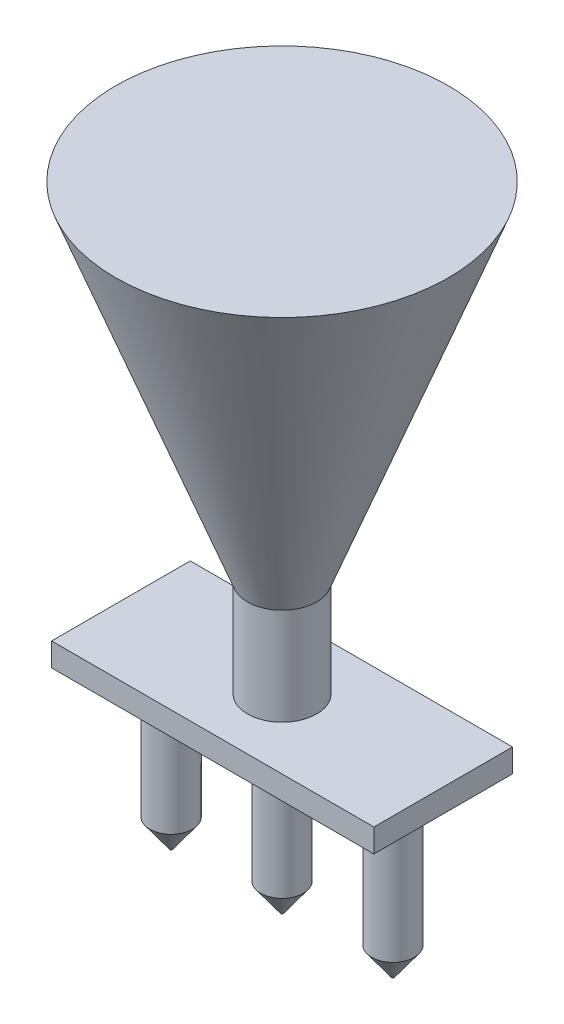
ISO-10303-21;
HEADER;
FILE_DESCRIPTION(('STEP AP214'),'2;1');
FILE_NAME('part.step','',(''),(''),'','','');
FILE_SCHEMA(('AUTOMOTIVE_DESIGN { 1 0 10303 214 1 1 1 1 }'));
ENDSEC;
DATA;
#1=APPLICATION_CONTEXT('core data for automotive mechanical design processes');
#2=APPLICATION_PROTOCOL_DEFINITION('international standard','automotive_design',2000,#1);
#3=PRODUCT_CONTEXT('',#1,'mechanical');
#4=PRODUCT('Part','Part','',(#3));
#5=PRODUCT_RELATED_PRODUCT_CATEGORY('part','',(#4));
#6=PRODUCT_DEFINITION_FORMATION('','',#4);
#7=PRODUCT_DEFINITION_CONTEXT('part definition',#1,'design');
#8=PRODUCT_DEFINITION('design','',#6,#7);
#9=PRODUCT_DEFINITION_SHAPE('','',#8);
#10=(LENGTH_UNIT() NAMED_UNIT(*) SI_UNIT(.MILLI.,.METRE.));
#11=(NAMED_UNIT(*) PLANE_ANGLE_UNIT() SI_UNIT($,.RADIAN.));
#12=(NAMED_UNIT(*) SI_UNIT($,.STERADIAN.) SOLID_ANGLE_UNIT());
#13=UNCERTAINTY_MEASURE_WITH_UNIT(LENGTH_MEASURE(1.E-05),#10,'distance_accuracy_value','');
#14=(GEOMETRIC_REPRESENTATION_CONTEXT(3) GLOBAL_UNCERTAINTY_ASSIGNED_CONTEXT((#13)) GLOBAL_UNIT_ASSIGNED_CONTEXT((#10,
#11,#12)) REPRESENTATION_CONTEXT('',''));
#15=CARTESIAN_POINT('',(0.,0.,0.));
#16=DIRECTION('',(0.,0.,1.));
#17=DIRECTION('',(1.,0.,0.));
#18=AXIS2_PLACEMENT_3D('',#15,#16,#17);
#19=CARTESIAN_POINT('',(116.23864248711,8.42900097567349,100.));
#20=DIRECTION('',(-1.,0.,0.));
#21=DIRECTION('',(0.,0.,1.));
#22=AXIS2_PLACEMENT_3D('',#19,#20,#21);
#23=PLANE('',#22);
#24=DIRECTION('',(0.,1.,0.));
#25=VECTOR('',#24,1.);
#26=CARTESIAN_POINT('',(116.23864248711,8.42900097567349,0.));
#27=LINE('',#26,#25);
#28=CARTESIAN_POINT('',(116.23864248711,-8.42900097567349,0.));
#29=VERTEX_POINT('',#28);
#30=CARTESIAN_POINT('',(116.23864248711,8.42900097567349,0.));
#31=VERTEX_POINT('',#30);
#32=EDGE_CURVE('E100',#29,#31,#27,.T.);
#33=ORIENTED_EDGE('',*,*,#32,.T.);
#34=DIRECTION('',(0.,0.,-1.));
#35=VECTOR('',#34,1.);
#36=CARTESIAN_POINT('',(116.23864248711,8.42900097567349,100.));
#37=LINE('',#36,#35);
#38=CARTESIAN_POINT('',(116.23864248711,8.42900097567349,100.));
#39=VERTEX_POINT('',#38);
#40=EDGE_CURVE('E91',#39,#31,#37,.T.);
#41=ORIENTED_EDGE('',*,*,#40,.F.);
#42=DIRECTION('',(0.,1.,0.));
#43=VECTOR('',#42,1.);
#44=CARTESIAN_POINT('',(116.23864248711,8.42900097567349,100.));
#45=LINE('',#44,#43);
#46=CARTESIAN_POINT('',(116.23864248711,-8.42900097567349,100.));
#47=VERTEX_POINT('',#46);
#48=EDGE_CURVE('E85',#47,#39,#45,.T.);
#49=ORIENTED_EDGE('',*,*,#48,.F.);
#50=DIRECTION('',(0.,0.,-1.));
#51=VECTOR('',#50,1.);
#52=CARTESIAN_POINT('',(116.23864248711,-8.42900097567349,100.));
#53=LINE('',#52,#51);
#54=EDGE_CURVE('E96',#47,#29,#53,.T.);
#55=ORIENTED_EDGE('',*,*,#54,.T.);
#56=EDGE_LOOP('',(#33,#41,#49,#55));
#57=FACE_BOUND('',#56,.T.);
#58=ADVANCED_FACE('F33',(#57),#23,.F.);
#59=CARTESIAN_POINT('',(-116.23864248711,8.42900097567349,100.));
#60=DIRECTION('',(0.,-1.,0.));
#61=DIRECTION('',(0.,0.,-1.));
#62=AXIS2_PLACEMENT_3D('',#59,#60,#61);
#63=PLANE('',#62);
#64=CARTESIAN_POINT('',(0.,8.42900097567349,50.));
#65=DIRECTION('',(0.,1.,0.));
#66=DIRECTION('',(0.,0.,1.));
#67=AXIS2_PLACEMENT_3D('',#64,#65,#66);
#68=CIRCLE('',#67,25.);
#69=CARTESIAN_POINT('',(0.,8.42900097567349,75.));
#70=VERTEX_POINT('',#69);
#71=EDGE_CURVE('E109',#70,#70,#68,.T.);
#72=ORIENTED_EDGE('',*,*,#71,.F.);
#73=EDGE_LOOP('',(#72));
#74=FACE_BOUND('',#73,.T.);
#75=DIRECTION('',(-1.,0.,0.));
#76=VECTOR('',#75,1.);
#77=CARTESIAN_POINT('',(-116.23864248711,8.42900097567349,0.));
#78=LINE('',#77,#76);
#79=CARTESIAN_POINT('',(-116.23864248711,8.42900097567349,0.));
#80=VERTEX_POINT('',#79);
#81=EDGE_CURVE('E90',#31,#80,#78,.T.);
#82=ORIENTED_EDGE('',*,*,#81,.T.);
#83=DIRECTION('',(0.,0.,-1.));
#84=VECTOR('',#83,1.);
#85=CARTESIAN_POINT('',(-116.23864248711,8.42900097567349,100.));
#86=LINE('',#85,#84);
#87=CARTESIAN_POINT('',(-116.23864248711,8.42900097567349,100.));
#88=VERTEX_POINT('',#87);
#89=EDGE_CURVE('E88',#88,#80,#86,.T.);
#90=ORIENTED_EDGE('',*,*,#89,.F.);
#91=DIRECTION('',(-1.,0.,0.));
#92=VECTOR('',#91,1.);
#93=CARTESIAN_POINT('',(-116.23864248711,8.42900097567349,100.));
#94=LINE('',#93,#92);
#95=EDGE_CURVE('E80',#39,#88,#94,.T.);
#96=ORIENTED_EDGE('',*,*,#95,.F.);
#97=ORIENTED_EDGE('',*,*,#40,.T.);
#98=EDGE_LOOP('',(#82,#90,#96,#97));
#99=FACE_BOUND('',#98,.T.);
#100=ADVANCED_FACE('F89',(#74,#99),#63,.F.);
#101=CARTESIAN_POINT('',(-116.23864248711,8.42900097567349,100.));
#102=DIRECTION('',(1.,0.,0.));
#103=DIRECTION('',(0.,0.,-1.));
#104=AXIS2_PLACEMENT_3D('',#101,#102,#103);
#105=PLANE('',#104);
#106=DIRECTION('',(0.,-1.,0.));
#107=VECTOR('',#106,1.);
#108=CARTESIAN_POINT('',(-116.23864248711,8.42900097567349,0.));
#109=LINE('',#108,#107);
#110=CARTESIAN_POINT('',(-116.23864248711,-8.42900097567349,0.));
#111=VERTEX_POINT('',#110);
#112=EDGE_CURVE('E66',#80,#111,#109,.T.);
#113=ORIENTED_EDGE('',*,*,#112,.T.);
#114=DIRECTION('',(0.,0.,-1.));
#115=VECTOR('',#114,1.);
#116=CARTESIAN_POINT('',(-116.23864248711,-8.42900097567349,100.));
#117=LINE('',#116,#115);
#118=CARTESIAN_POINT('',(-116.23864248711,-8.42900097567349,100.));
#119=VERTEX_POINT('',#118);
#120=EDGE_CURVE('E92',#119,#111,#117,.T.);
#121=ORIENTED_EDGE('',*,*,#120,.F.);
#122=DIRECTION('',(0.,-1.,0.));
#123=VECTOR('',#122,1.);
#124=CARTESIAN_POINT('',(-116.23864248711,8.42900097567349,100.));
#125=LINE('',#124,#123);
#126=EDGE_CURVE('E83',#88,#119,#125,.T.);
#127=ORIENTED_EDGE('',*,*,#126,.F.);
#128=ORIENTED_EDGE('',*,*,#89,.T.);
#129=EDGE_LOOP('',(#113,#121,#127,#128));
#130=FACE_BOUND('',#129,.T.);
#131=ADVANCED_FACE('F94',(#130),#105,.F.);
#132=CARTESIAN_POINT('',(-116.23864248711,-8.42900097567349,100.));
#133=DIRECTION('',(0.,1.,0.));
#134=DIRECTION('',(0.,0.,1.));
#135=AXIS2_PLACEMENT_3D('',#132,#133,#134);
#136=PLANE('',#135);
#137=CARTESIAN_POINT('',(-80.,-8.42900097567349,50.));
#138=DIRECTION('',(0.,1.,0.));
#139=DIRECTION('',(0.,0.,1.));
#140=AXIS2_PLACEMENT_3D('',#137,#138,#139);
#141=CIRCLE('',#140,20.);
#142=CARTESIAN_POINT('',(-80.,-8.42900097567349,70.));
#143=VERTEX_POINT('',#142);
#144=EDGE_CURVE('E11',#143,#143,#141,.F.);
#145=ORIENTED_EDGE('',*,*,#144,.F.);
#146=EDGE_LOOP('',(#145));
#147=FACE_BOUND('',#146,.T.);
#148=CARTESIAN_POINT('',(80.,-8.42900097567349,50.));
#149=DIRECTION('',(0.,1.,0.));
#150=DIRECTION('',(0.,0.,1.));
#151=AXIS2_PLACEMENT_3D('',#148,#149,#150);
#152=CIRCLE('',#151,20.);
#153=CARTESIAN_POINT('',(80.,-8.42900097567349,70.));
#154=VERTEX_POINT('',#153);
#155=EDGE_CURVE('E41',#154,#154,#152,.F.);
#156=ORIENTED_EDGE('',*,*,#155,.F.);
#157=EDGE_LOOP('',(#156));
#158=FACE_BOUND('',#157,.T.);
#159=CARTESIAN_POINT('',(0.,-8.42900097567349,50.));
#160=DIRECTION('',(0.,-1.,0.));
#161=DIRECTION('',(0.,0.,-1.));
#162=AXIS2_PLACEMENT_3D('',#159,#160,#161);
#163=CIRCLE('',#162,20.);
#164=CARTESIAN_POINT('',(0.,-8.42900097567349,30.));
#165=VERTEX_POINT('',#164);
#166=EDGE_CURVE('E111',#165,#165,#163,.T.);
#167=ORIENTED_EDGE('',*,*,#166,.F.);
#168=EDGE_LOOP('',(#167));
#169=FACE_BOUND('',#168,.T.);
#170=DIRECTION('',(1.,0.,0.));
#171=VECTOR('',#170,1.);
#172=CARTESIAN_POINT('',(-116.23864248711,-8.42900097567349,0.));
#173=LINE('',#172,#171);
#174=EDGE_CURVE('E72',#111,#29,#173,.T.);
#175=ORIENTED_EDGE('',*,*,#174,.T.);
#176=ORIENTED_EDGE('',*,*,#54,.F.);
#177=DIRECTION('',(1.,0.,0.));
#178=VECTOR('',#177,1.);
#179=CARTESIAN_POINT('',(-116.23864248711,-8.42900097567349,100.));
#180=LINE('',#179,#178);
#181=EDGE_CURVE('E49',#119,#47,#180,.T.);
#182=ORIENTED_EDGE('',*,*,#181,.F.);
#183=ORIENTED_EDGE('',*,*,#120,.T.);
#184=EDGE_LOOP('',(#175,#176,#182,#183));
#185=FACE_BOUND('',#184,.T.);
#186=ADVANCED_FACE('F146',(#147,#158,#169,#185),#136,.F.);
#187=CARTESIAN_POINT('',(0.,0.,100.));
#188=DIRECTION('',(0.,0.,1.));
#189=DIRECTION('',(1.,0.,0.));
#190=AXIS2_PLACEMENT_3D('',#187,#188,#189);
#191=PLANE('',#190);
#192=ORIENTED_EDGE('',*,*,#48,.T.);
#193=ORIENTED_EDGE('',*,*,#95,.T.);
#194=ORIENTED_EDGE('',*,*,#126,.T.);
#195=ORIENTED_EDGE('',*,*,#181,.T.);
#196=EDGE_LOOP('',(#192,#193,#194,#195));
#197=FACE_BOUND('',#196,.T.);
#198=ADVANCED_FACE('F81',(#197),#191,.T.);
#199=CARTESIAN_POINT('',(0.,0.,0.));
#200=DIRECTION('',(0.,0.,1.));
#201=DIRECTION('',(1.,0.,0.));
#202=AXIS2_PLACEMENT_3D('',#199,#200,#201);
#203=PLANE('',#202);
#204=ORIENTED_EDGE('',*,*,#32,.F.);
#205=ORIENTED_EDGE('',*,*,#174,.F.);
#206=ORIENTED_EDGE('',*,*,#112,.F.);
#207=ORIENTED_EDGE('',*,*,#81,.F.);
#208=EDGE_LOOP('',(#204,#205,#206,#207));
#209=FACE_BOUND('',#208,.T.);
#210=ADVANCED_FACE('F137',(#209),#203,.F.);
#211=CARTESIAN_POINT('',(0.,78.4290009756735,50.));
#212=DIRECTION('',(0.,-1.,0.));
#213=DIRECTION('',(0.,0.,-1.));
#214=AXIS2_PLACEMENT_3D('',#211,#212,#213);
#215=CYLINDRICAL_SURFACE('',#214,25.);
#216=CARTESIAN_POINT('',(0.,78.4290009756735,50.));
#217=DIRECTION('',(0.,1.,0.));
#218=DIRECTION('',(0.,0.,1.));
#219=AXIS2_PLACEMENT_3D('',#216,#217,#218);
#220=CIRCLE('',#219,25.);
#221=CARTESIAN_POINT('',(0.,78.4290009756735,75.));
#222=VERTEX_POINT('',#221);
#223=EDGE_CURVE('E103',#222,#222,#220,.T.);
#224=ORIENTED_EDGE('',*,*,#223,.F.);
#225=EDGE_LOOP('',(#224));
#226=FACE_BOUND('',#225,.T.);
#227=ORIENTED_EDGE('',*,*,#71,.T.);
#228=EDGE_LOOP('',(#227));
#229=FACE_BOUND('',#228,.T.);
#230=ADVANCED_FACE('F133',(#226,#229),#215,.T.);
#231=CARTESIAN_POINT('',(0.,-8.42900097567349,50.));
#232=DIRECTION('',(0.,1.,0.));
#233=DIRECTION('',(0.,0.,-1.));
#234=AXIS2_PLACEMENT_3D('',#231,#232,#233);
#235=CONICAL_SURFACE('',#234,20.,0.226892802759263);
#236=CARTESIAN_POINT('',(0.,-28.4290009756735,50.));
#237=DIRECTION('',(0.,-1.,0.));
#238=DIRECTION('',(0.,0.,-1.));
#239=AXIS2_PLACEMENT_3D('',#236,#237,#238);
#240=CIRCLE('',#239,15.3826361774887);
#241=CARTESIAN_POINT('',(0.,-28.4290009756735,34.6173638225113));
#242=VERTEX_POINT('',#241);
#243=EDGE_CURVE('E124',#242,#242,#240,.T.);
#244=ORIENTED_EDGE('',*,*,#243,.F.);
#245=EDGE_LOOP('',(#244));
#246=FACE_BOUND('',#245,.T.);
#247=ORIENTED_EDGE('',*,*,#166,.T.);
#248=EDGE_LOOP('',(#247));
#249=FACE_BOUND('',#248,.T.);
#250=ADVANCED_FACE('F136',(#246,#249),#235,.T.);
#251=CARTESIAN_POINT('',(0.,-108.429000975673,50.));
#252=DIRECTION('',(0.,1.,0.));
#253=DIRECTION('',(0.,0.,1.));
#254=AXIS2_PLACEMENT_3D('',#251,#252,#253);
#255=CYLINDRICAL_SURFACE('',#254,15.3826361774887);
#256=CARTESIAN_POINT('',(0.,-108.429000975673,50.));
#257=DIRECTION('',(0.,-1.,0.));
#258=DIRECTION('',(0.,0.,-1.));
#259=AXIS2_PLACEMENT_3D('',#256,#257,#258);
#260=CIRCLE('',#259,15.3826361774887);
#261=CARTESIAN_POINT('',(0.,-108.429000975673,34.6173638225112));
#262=VERTEX_POINT('',#261);
#263=EDGE_CURVE('E122',#262,#262,#260,.T.);
#264=ORIENTED_EDGE('',*,*,#263,.F.);
#265=EDGE_LOOP('',(#264));
#266=FACE_BOUND('',#265,.T.);
#267=ORIENTED_EDGE('',*,*,#243,.T.);
#268=EDGE_LOOP('',(#267));
#269=FACE_BOUND('',#268,.T.);
#270=ADVANCED_FACE('F160',(#266,#269),#255,.T.);
#271=CARTESIAN_POINT('',(0.,-108.429000975673,50.));
#272=DIRECTION('',(0.,1.,0.));
#273=DIRECTION('',(0.,0.,-1.));
#274=AXIS2_PLACEMENT_3D('',#271,#272,#273);
#275=CONICAL_SURFACE('',#274,15.3826361774888,0.628318530717959);
#276=CARTESIAN_POINT('',(0.,-128.429000975673,50.));
#277=DIRECTION('',(0.,-1.,0.));
#278=DIRECTION('',(0.,0.,-1.));
#279=AXIS2_PLACEMENT_3D('',#276,#277,#278);
#280=CIRCLE('',#279,0.851785617381522);
#281=CARTESIAN_POINT('',(0.,-128.429000975673,49.1482143826185));
#282=VERTEX_POINT('',#281);
#283=EDGE_CURVE('E370',#282,#282,#280,.T.);
#284=CARTESIAN_POINT('',(0.,-128.429000975673,49.1482143826185));
#285=CARTESIAN_POINT('',(0.,-128.22066764234,48.9968513559507));
#286=CARTESIAN_POINT('',(0.,-128.012334309007,48.8454883292829));
#287=CARTESIAN_POINT('',(0.,-127.59566764234,48.5427622759473));
#288=CARTESIAN_POINT('',(0.,-127.387334309007,48.3913992492796));
#289=CARTESIAN_POINT('',(0.,-126.97066764234,48.088673195944));
#290=CARTESIAN_POINT('',(0.,-126.762334309007,47.9373101692762));
#291=CARTESIAN_POINT('',(0.,-126.34566764234,47.6345841159406));
#292=CARTESIAN_POINT('',(0.,-126.137334309007,47.4832210892728));
#293=CARTESIAN_POINT('',(0.,-125.72066764234,47.1804950359373));
#294=CARTESIAN_POINT('',(0.,-125.512334309007,47.0291320092695));
#295=CARTESIAN_POINT('',(0.,-125.09566764234,46.7264059559339));
#296=CARTESIAN_POINT('',(0.,-124.887334309007,46.5750429292661));
#297=CARTESIAN_POINT('',(0.,-124.47066764234,46.2723168759306));
#298=CARTESIAN_POINT('',(0.,-124.262334309007,46.1209538492628));
#299=CARTESIAN_POINT('',(0.,-123.84566764234,45.8182277959272));
#300=CARTESIAN_POINT('',(0.,-123.637334309007,45.6668647692594));
#301=CARTESIAN_POINT('',(0.,-123.22066764234,45.3641387159239));
#302=CARTESIAN_POINT('',(0.,-123.012334309007,45.2127756892561));
#303=CARTESIAN_POINT('',(0.,-122.59566764234,44.9100496359205));
#304=CARTESIAN_POINT('',(0.,-122.387334309007,44.7586866092527));
#305=CARTESIAN_POINT('',(0.,-121.97066764234,44.4559605559172));
#306=CARTESIAN_POINT('',(0.,-121.762334309007,44.3045975292494));
#307=CARTESIAN_POINT('',(0.,-121.34566764234,44.0018714759138));
#308=CARTESIAN_POINT('',(0.,-121.137334309007,43.850508449246));
#309=CARTESIAN_POINT('',(0.,-120.72066764234,43.5477823959105));
#310=CARTESIAN_POINT('',(0.,-120.512334309007,43.3964193692427));
#311=CARTESIAN_POINT('',(0.,-120.09566764234,43.0936933159071));
#312=CARTESIAN_POINT('',(0.,-119.887334309007,42.9423302892393));
#313=CARTESIAN_POINT('',(0.,-119.47066764234,42.6396042359038));
#314=CARTESIAN_POINT('',(0.,-119.262334309007,42.488241209236));
#315=CARTESIAN_POINT('',(0.,-118.84566764234,42.1855151559004));
#316=CARTESIAN_POINT('',(0.,-118.637334309007,42.0341521292326));
#317=CARTESIAN_POINT('',(0.,-118.22066764234,41.7314260758971));
#318=CARTESIAN_POINT('',(0.,-118.012334309007,41.5800630492293));
#319=CARTESIAN_POINT('',(0.,-117.59566764234,41.2773369958937));
#320=CARTESIAN_POINT('',(0.,-117.387334309007,41.1259739692259));
#321=CARTESIAN_POINT('',(0.,-116.97066764234,40.8232479158904));
#322=CARTESIAN_POINT('',(0.,-116.762334309007,40.6718848892226));
#323=CARTESIAN_POINT('',(0.,-116.34566764234,40.369158835887));
#324=CARTESIAN_POINT('',(0.,-116.137334309007,40.2177958092192));
#325=CARTESIAN_POINT('',(0.,-115.72066764234,39.9150697558837));
#326=CARTESIAN_POINT('',(0.,-115.512334309007,39.7637067292159));
#327=CARTESIAN_POINT('',(0.,-115.09566764234,39.4609806758803));
#328=CARTESIAN_POINT('',(0.,-114.887334309007,39.3096176492125));
#329=CARTESIAN_POINT('',(0.,-114.47066764234,39.006891595877));
#330=CARTESIAN_POINT('',(0.,-114.262334309007,38.8555285692092));
#331=CARTESIAN_POINT('',(0.,-113.84566764234,38.5528025158736));
#332=CARTESIAN_POINT('',(0.,-113.637334309007,38.4014394892058));
#333=CARTESIAN_POINT('',(0.,-113.22066764234,38.0987134358703));
#334=CARTESIAN_POINT('',(0.,-113.012334309007,37.9473504092025));
#335=CARTESIAN_POINT('',(0.,-112.59566764234,37.6446243558669));
#336=CARTESIAN_POINT('',(0.,-112.387334309007,37.4932613291991));
#337=CARTESIAN_POINT('',(0.,-111.97066764234,37.1905352758636));
#338=CARTESIAN_POINT('',(0.,-111.762334309007,37.0391722491958));
#339=CARTESIAN_POINT('',(0.,-111.34566764234,36.7364461958602));
#340=CARTESIAN_POINT('',(0.,-111.137334309007,36.5850831691924));
#341=CARTESIAN_POINT('',(0.,-110.72066764234,36.2823571158569));
#342=CARTESIAN_POINT('',(0.,-110.512334309007,36.1309940891891));
#343=CARTESIAN_POINT('',(0.,-110.09566764234,35.8282680358535));
#344=CARTESIAN_POINT('',(0.,-109.887334309007,35.6769050091857));
#345=CARTESIAN_POINT('',(0.,-109.47066764234,35.3741789558502));
#346=CARTESIAN_POINT('',(0.,-109.262334309007,35.2228159291824));
#347=CARTESIAN_POINT('',(0.,-108.84566764234,34.9200898758468));
#348=CARTESIAN_POINT('',(0.,-108.637334309007,34.768726849179));
#349=CARTESIAN_POINT('',(0.,-108.429000975673,34.6173638225112));
#350=B_SPLINE_CURVE_WITH_KNOTS('',3,(#284,#285,#286,#287,#288,#289,#290,#291,#292,#293,#294,
#295,#296,#297,#298,#299,#300,#301,#302,#303,#304,#305,#306,#307,#308,#309,#310,#311,#312,#313,
#314,#315,#316,#317,#318,#319,#320,#321,#322,#323,#324,#325,#326,#327,#328,#329,#330,#331,#332,
#333,#334,#335,#336,#337,#338,#339,#340,#341,#342,#343,#344,#345,#346,#347,#348,#349),
.UNSPECIFIED.,.F.,.F.,(4,2,2,2,2,2,2,2,2,2,2,2,2,2,2,2,2,2,2,2,2,2,2,2,2,2,2,2,2,2,2,2,4),(0.,
0.772542485937357,1.54508497187471,2.31762745781209,3.09016994374945,3.86271242968683,
4.63525491562419,5.40779740156157,6.18033988749893,6.9528823734363,7.72542485937367,
8.49796734531103,9.27050983124841,10.0430523171858,10.8155948031231,11.5881372890605,
12.3606797749979,13.1332222609352,13.9057647468726,14.67830723281,15.4508497187474,
16.2233922046847,16.9959346906221,17.7684771765595,18.5410196624968,19.3135621484342,
20.0861046343716,20.8586471203089,21.6311896062463,22.4037320921837,23.176274578121,
23.9488170640584,24.7213595499958),.UNSPECIFIED.);
#351=EDGE_CURVE('BSEAM164',#282,#262,#350,.T.);
#352=ORIENTED_EDGE('',*,*,#283,.F.);
#353=ORIENTED_EDGE('',*,*,#263,.T.);
#354=ORIENTED_EDGE('',*,*,#351,.T.);
#355=ORIENTED_EDGE('',*,*,#351,.F.);
#356=EDGE_LOOP('',(#352,#354,#353,#355));
#357=FACE_BOUND('',#356,.T.);
#358=ADVANCED_FACE('F164',(#357),#275,.T.);
#359=CARTESIAN_POINT('',(0.,-128.429000975673,50.));
#360=DIRECTION('',(0.,-1.,0.));
#361=DIRECTION('',(0.,0.,-1.));
#362=AXIS2_PLACEMENT_3D('',#359,#360,#361);
#363=PLANE('',#362);
#364=ORIENTED_EDGE('',*,*,#283,.T.);
#365=EDGE_LOOP('',(#364));
#366=FACE_BOUND('',#365,.T.);
#367=ADVANCED_FACE('F168',(#366),#363,.T.);
#368=CARTESIAN_POINT('',(80.,-8.42900097567349,50.));
#369=DIRECTION('',(0.,1.,0.));
#370=DIRECTION('',(0.,0.,-1.));
#371=AXIS2_PLACEMENT_3D('',#368,#369,#370);
#372=CONICAL_SURFACE('',#371,20.,0.226892802759263);
#373=CARTESIAN_POINT('',(80.,-28.4290009756735,50.));
#374=DIRECTION('',(0.,-1.,0.));
#375=DIRECTION('',(0.,0.,-1.));
#376=AXIS2_PLACEMENT_3D('',#373,#374,#375);
#377=CIRCLE('',#376,15.3826361774887);
#378=CARTESIAN_POINT('',(80.,-28.4290009756735,34.6173638225113));
#379=VERTEX_POINT('',#378);
#380=EDGE_CURVE('E368',#379,#379,#377,.T.);
#381=ORIENTED_EDGE('',*,*,#380,.F.);
#382=EDGE_LOOP('',(#381));
#383=FACE_BOUND('',#382,.T.);
#384=ORIENTED_EDGE('',*,*,#155,.T.);
#385=EDGE_LOOP('',(#384));
#386=FACE_BOUND('',#385,.T.);
#387=ADVANCED_FACE('F172',(#383,#386),#372,.T.);
#388=CARTESIAN_POINT('',(80.,-108.429000975673,50.));
#389=DIRECTION('',(0.,1.,0.));
#390=DIRECTION('',(0.,0.,1.));
#391=AXIS2_PLACEMENT_3D('',#388,#389,#390);
#392=CYLINDRICAL_SURFACE('',#391,15.3826361774887);
#393=CARTESIAN_POINT('',(80.,-108.429000975673,50.));
#394=DIRECTION('',(0.,-1.,0.));
#395=DIRECTION('',(0.,0.,-1.));
#396=AXIS2_PLACEMENT_3D('',#393,#394,#395);
#397=CIRCLE('',#396,15.3826361774887);
#398=CARTESIAN_POINT('',(80.,-108.429000975673,34.6173638225112));
#399=VERTEX_POINT('',#398);
#400=EDGE_CURVE('E365',#399,#399,#397,.T.);
#401=ORIENTED_EDGE('',*,*,#400,.F.);
#402=EDGE_LOOP('',(#401));
#403=FACE_BOUND('',#402,.T.);
#404=ORIENTED_EDGE('',*,*,#380,.T.);
#405=EDGE_LOOP('',(#404));
#406=FACE_BOUND('',#405,.T.);
#407=ADVANCED_FACE('F176',(#403,#406),#392,.T.);
#408=CARTESIAN_POINT('',(80.,-108.429000975673,50.));
#409=DIRECTION('',(0.,1.,0.));
#410=DIRECTION('',(0.,0.,-1.));
#411=AXIS2_PLACEMENT_3D('',#408,#409,#410);
#412=CONICAL_SURFACE('',#411,15.3826361774888,0.628318530717959);
#413=CARTESIAN_POINT('',(80.,-128.429000975673,50.));
#414=DIRECTION('',(0.,-1.,0.));
#415=DIRECTION('',(0.,0.,-1.));
#416=AXIS2_PLACEMENT_3D('',#413,#414,#415);
#417=CIRCLE('',#416,0.851785617381522);
#418=CARTESIAN_POINT('',(80.,-128.429000975673,49.1482143826185));
#419=VERTEX_POINT('',#418);
#420=EDGE_CURVE('E362',#419,#419,#417,.T.);
#421=CARTESIAN_POINT('',(80.,-128.429000975673,49.1482143826185));
#422=CARTESIAN_POINT('',(80.,-128.22066764234,48.9968513559507));
#423=CARTESIAN_POINT('',(80.,-128.012334309007,48.8454883292829));
#424=CARTESIAN_POINT('',(80.,-127.59566764234,48.5427622759473));
#425=CARTESIAN_POINT('',(80.,-127.387334309007,48.3913992492796));
#426=CARTESIAN_POINT('',(80.,-126.97066764234,48.088673195944));
#427=CARTESIAN_POINT('',(80.,-126.762334309007,47.9373101692762));
#428=CARTESIAN_POINT('',(80.,-126.34566764234,47.6345841159406));
#429=CARTESIAN_POINT('',(80.,-126.137334309007,47.4832210892728));
#430=CARTESIAN_POINT('',(80.,-125.72066764234,47.1804950359373));
#431=CARTESIAN_POINT('',(80.,-125.512334309007,47.0291320092695));
#432=CARTESIAN_POINT('',(80.,-125.09566764234,46.7264059559339));
#433=CARTESIAN_POINT('',(80.,-124.887334309007,46.5750429292661));
#434=CARTESIAN_POINT('',(80.,-124.47066764234,46.2723168759306));
#435=CARTESIAN_POINT('',(80.,-124.262334309007,46.1209538492628));
#436=CARTESIAN_POINT('',(80.,-123.84566764234,45.8182277959272));
#437=CARTESIAN_POINT('',(80.,-123.637334309007,45.6668647692594));
#438=CARTESIAN_POINT('',(80.,-123.22066764234,45.3641387159239));
#439=CARTESIAN_POINT('',(80.,-123.012334309007,45.2127756892561));
#440=CARTESIAN_POINT('',(80.,-122.59566764234,44.9100496359205));
#441=CARTESIAN_POINT('',(80.,-122.387334309007,44.7586866092527));
#442=CARTESIAN_POINT('',(80.,-121.97066764234,44.4559605559172));
#443=CARTESIAN_POINT('',(80.,-121.762334309007,44.3045975292494));
#444=CARTESIAN_POINT('',(80.,-121.34566764234,44.0018714759138));
#445=CARTESIAN_POINT('',(80.,-121.137334309007,43.850508449246));
#446=CARTESIAN_POINT('',(80.,-120.72066764234,43.5477823959105));
#447=CARTESIAN_POINT('',(80.,-120.512334309007,43.3964193692427));
#448=CARTESIAN_POINT('',(80.,-120.09566764234,43.0936933159071));
#449=CARTESIAN_POINT('',(80.,-119.887334309007,42.9423302892393));
#450=CARTESIAN_POINT('',(80.,-119.47066764234,42.6396042359038));
#451=CARTESIAN_POINT('',(80.,-119.262334309007,42.488241209236));
#452=CARTESIAN_POINT('',(80.,-118.84566764234,42.1855151559004));
#453=CARTESIAN_POINT('',(80.,-118.637334309007,42.0341521292326));
#454=CARTESIAN_POINT('',(80.,-118.22066764234,41.7314260758971));
#455=CARTESIAN_POINT('',(80.,-118.012334309007,41.5800630492293));
#456=CARTESIAN_POINT('',(80.,-117.59566764234,41.2773369958937));
#457=CARTESIAN_POINT('',(80.,-117.387334309007,41.1259739692259));
#458=CARTESIAN_POINT('',(80.,-116.97066764234,40.8232479158904));
#459=CARTESIAN_POINT('',(80.,-116.762334309007,40.6718848892226));
#460=CARTESIAN_POINT('',(80.,-116.34566764234,40.369158835887));
#461=CARTESIAN_POINT('',(80.,-116.137334309007,40.2177958092192));
#462=CARTESIAN_POINT('',(80.,-115.72066764234,39.9150697558837));
#463=CARTESIAN_POINT('',(80.,-115.512334309007,39.7637067292159));
#464=CARTESIAN_POINT('',(80.,-115.09566764234,39.4609806758803));
#465=CARTESIAN_POINT('',(80.,-114.887334309007,39.3096176492125));
#466=CARTESIAN_POINT('',(80.,-114.47066764234,39.006891595877));
#467=CARTESIAN_POINT('',(80.,-114.262334309007,38.8555285692092));
#468=CARTESIAN_POINT('',(80.,-113.84566764234,38.5528025158736));
#469=CARTESIAN_POINT('',(80.,-113.637334309007,38.4014394892058));
#470=CARTESIAN_POINT('',(80.,-113.22066764234,38.0987134358703));
#471=CARTESIAN_POINT('',(80.,-113.012334309007,37.9473504092025));
#472=CARTESIAN_POINT('',(80.,-112.59566764234,37.6446243558669));
#473=CARTESIAN_POINT('',(80.,-112.387334309007,37.4932613291991));
#474=CARTESIAN_POINT('',(80.,-111.97066764234,37.1905352758636));
#475=CARTESIAN_POINT('',(80.,-111.762334309007,37.0391722491958));
#476=CARTESIAN_POINT('',(80.,-111.34566764234,36.7364461958602));
#477=CARTESIAN_POINT('',(80.,-111.137334309007,36.5850831691924));
#478=CARTESIAN_POINT('',(80.,-110.72066764234,36.2823571158569));
#479=CARTESIAN_POINT('',(80.,-110.512334309007,36.1309940891891));
#480=CARTESIAN_POINT('',(80.,-110.09566764234,35.8282680358535));
#481=CARTESIAN_POINT('',(80.,-109.887334309007,35.6769050091857));
#482=CARTESIAN_POINT('',(80.,-109.47066764234,35.3741789558502));
#483=CARTESIAN_POINT('',(80.,-109.262334309007,35.2228159291824));
#484=CARTESIAN_POINT('',(80.,-108.84566764234,34.9200898758468));
#485=CARTESIAN_POINT('',(80.,-108.637334309007,34.768726849179));
#486=CARTESIAN_POINT('',(80.,-108.429000975673,34.6173638225112));
#487=B_SPLINE_CURVE_WITH_KNOTS('',3,(#421,#422,#423,#424,#425,#426,#427,#428,#429,#430,#431,
#432,#433,#434,#435,#436,#437,#438,#439,#440,#441,#442,#443,#444,#445,#446,#447,#448,#449,#450,
#451,#452,#453,#454,#455,#456,#457,#458,#459,#460,#461,#462,#463,#464,#465,#466,#467,#468,#469,
#470,#471,#472,#473,#474,#475,#476,#477,#478,#479,#480,#481,#482,#483,#484,#485,#486),
.UNSPECIFIED.,.F.,.F.,(4,2,2,2,2,2,2,2,2,2,2,2,2,2,2,2,2,2,2,2,2,2,2,2,2,2,2,2,2,2,2,2,4),(0.,
0.772542485937357,1.54508497187471,2.31762745781209,3.09016994374945,3.86271242968683,
4.63525491562419,5.40779740156157,6.18033988749893,6.9528823734363,7.72542485937367,
8.49796734531103,9.27050983124841,10.0430523171858,10.8155948031231,11.5881372890605,
12.3606797749979,13.1332222609352,13.9057647468726,14.67830723281,15.4508497187474,
16.2233922046847,16.9959346906221,17.7684771765595,18.5410196624968,19.3135621484342,
20.0861046343716,20.8586471203089,21.6311896062463,22.4037320921837,23.176274578121,
23.9488170640584,24.7213595499958),.UNSPECIFIED.);
#488=EDGE_CURVE('BSEAM180',#419,#399,#487,.T.);
#489=ORIENTED_EDGE('',*,*,#420,.F.);
#490=ORIENTED_EDGE('',*,*,#400,.T.);
#491=ORIENTED_EDGE('',*,*,#488,.T.);
#492=ORIENTED_EDGE('',*,*,#488,.F.);
#493=EDGE_LOOP('',(#489,#491,#490,#492));
#494=FACE_BOUND('',#493,.T.);
#495=ADVANCED_FACE('F180',(#494),#412,.T.);
#496=CARTESIAN_POINT('',(80.,-128.429000975673,50.));
#497=DIRECTION('',(0.,-1.,0.));
#498=DIRECTION('',(0.,0.,-1.));
#499=AXIS2_PLACEMENT_3D('',#496,#497,#498);
#500=PLANE('',#499);
#501=ORIENTED_EDGE('',*,*,#420,.T.);
#502=EDGE_LOOP('',(#501));
#503=FACE_BOUND('',#502,.T.);
#504=ADVANCED_FACE('F184',(#503),#500,.T.);
#505=CARTESIAN_POINT('',(-80.,-8.42900097567349,50.));
#506=DIRECTION('',(0.,1.,0.));
#507=DIRECTION('',(0.,0.,-1.));
#508=AXIS2_PLACEMENT_3D('',#505,#506,#507);
#509=CONICAL_SURFACE('',#508,20.,0.226892802759263);
#510=CARTESIAN_POINT('',(-80.,-28.4290009756735,50.));
#511=DIRECTION('',(0.,-1.,0.));
#512=DIRECTION('',(0.,0.,-1.));
#513=AXIS2_PLACEMENT_3D('',#510,#511,#512);
#514=CIRCLE('',#513,15.3826361774887);
#515=CARTESIAN_POINT('',(-80.,-28.4290009756735,34.6173638225113));
#516=VERTEX_POINT('',#515);
#517=EDGE_CURVE('E359',#516,#516,#514,.T.);
#518=ORIENTED_EDGE('',*,*,#517,.F.);
#519=EDGE_LOOP('',(#518));
#520=FACE_BOUND('',#519,.T.);
#521=ORIENTED_EDGE('',*,*,#144,.T.);
#522=EDGE_LOOP('',(#521));
#523=FACE_BOUND('',#522,.T.);
#524=ADVANCED_FACE('F188',(#520,#523),#509,.T.);
#525=CARTESIAN_POINT('',(-80.,-108.429000975673,50.));
#526=DIRECTION('',(0.,1.,0.));
#527=DIRECTION('',(0.,0.,1.));
#528=AXIS2_PLACEMENT_3D('',#525,#526,#527);
#529=CYLINDRICAL_SURFACE('',#528,15.3826361774887);
#530=CARTESIAN_POINT('',(-80.,-108.429000975673,50.));
#531=DIRECTION('',(0.,-1.,0.));
#532=DIRECTION('',(0.,0.,-1.));
#533=AXIS2_PLACEMENT_3D('',#530,#531,#532);
#534=CIRCLE('',#533,15.3826361774887);
#535=CARTESIAN_POINT('',(-80.,-108.429000975673,34.6173638225112));
#536=VERTEX_POINT('',#535);
#537=EDGE_CURVE('E356',#536,#536,#534,.T.);
#538=ORIENTED_EDGE('',*,*,#537,.F.);
#539=EDGE_LOOP('',(#538));
#540=FACE_BOUND('',#539,.T.);
#541=ORIENTED_EDGE('',*,*,#517,.T.);
#542=EDGE_LOOP('',(#541));
#543=FACE_BOUND('',#542,.T.);
#544=ADVANCED_FACE('F192',(#540,#543),#529,.T.);
#545=CARTESIAN_POINT('',(-80.,-108.429000975673,50.));
#546=DIRECTION('',(0.,1.,0.));
#547=DIRECTION('',(0.,0.,-1.));
#548=AXIS2_PLACEMENT_3D('',#545,#546,#547);
#549=CONICAL_SURFACE('',#548,15.3826361774888,0.628318530717959);
#550=CARTESIAN_POINT('',(-80.,-128.429000975673,50.));
#551=DIRECTION('',(0.,-1.,0.));
#552=DIRECTION('',(0.,0.,-1.));
#553=AXIS2_PLACEMENT_3D('',#550,#551,#552);
#554=CIRCLE('',#553,0.851785617381522);
#555=CARTESIAN_POINT('',(-80.,-128.429000975673,49.1482143826185));
#556=VERTEX_POINT('',#555);
#557=EDGE_CURVE('E351',#556,#556,#554,.T.);
#558=CARTESIAN_POINT('',(-80.,-128.429000975673,49.1482143826185));
#559=CARTESIAN_POINT('',(-80.,-128.22066764234,48.9968513559507));
#560=CARTESIAN_POINT('',(-80.,-128.012334309007,48.8454883292829));
#561=CARTESIAN_POINT('',(-80.,-127.59566764234,48.5427622759473));
#562=CARTESIAN_POINT('',(-80.,-127.387334309007,48.3913992492796));
#563=CARTESIAN_POINT('',(-80.,-126.97066764234,48.088673195944));
#564=CARTESIAN_POINT('',(-80.,-126.762334309007,47.9373101692762));
#565=CARTESIAN_POINT('',(-80.,-126.34566764234,47.6345841159406));
#566=CARTESIAN_POINT('',(-80.,-126.137334309007,47.4832210892728));
#567=CARTESIAN_POINT('',(-80.,-125.72066764234,47.1804950359373));
#568=CARTESIAN_POINT('',(-80.,-125.512334309007,47.0291320092695));
#569=CARTESIAN_POINT('',(-80.,-125.09566764234,46.7264059559339));
#570=CARTESIAN_POINT('',(-80.,-124.887334309007,46.5750429292661));
#571=CARTESIAN_POINT('',(-80.,-124.47066764234,46.2723168759306));
#572=CARTESIAN_POINT('',(-80.,-124.262334309007,46.1209538492628));
#573=CARTESIAN_POINT('',(-80.,-123.84566764234,45.8182277959272));
#574=CARTESIAN_POINT('',(-80.,-123.637334309007,45.6668647692594));
#575=CARTESIAN_POINT('',(-80.,-123.22066764234,45.3641387159239));
#576=CARTESIAN_POINT('',(-80.,-123.012334309007,45.2127756892561));
#577=CARTESIAN_POINT('',(-80.,-122.59566764234,44.9100496359205));
#578=CARTESIAN_POINT('',(-80.,-122.387334309007,44.7586866092527));
#579=CARTESIAN_POINT('',(-80.,-121.97066764234,44.4559605559172));
#580=CARTESIAN_POINT('',(-80.,-121.762334309007,44.3045975292494));
#581=CARTESIAN_POINT('',(-80.,-121.34566764234,44.0018714759138));
#582=CARTESIAN_POINT('',(-80.,-121.137334309007,43.850508449246));
#583=CARTESIAN_POINT('',(-80.,-120.72066764234,43.5477823959105));
#584=CARTESIAN_POINT('',(-80.,-120.512334309007,43.3964193692427));
#585=CARTESIAN_POINT('',(-80.,-120.09566764234,43.0936933159071));
#586=CARTESIAN_POINT('',(-80.,-119.887334309007,42.9423302892393));
#587=CARTESIAN_POINT('',(-80.,-119.47066764234,42.6396042359038));
#588=CARTESIAN_POINT('',(-80.,-119.262334309007,42.488241209236));
#589=CARTESIAN_POINT('',(-80.,-118.84566764234,42.1855151559004));
#590=CARTESIAN_POINT('',(-80.,-118.637334309007,42.0341521292326));
#591=CARTESIAN_POINT('',(-80.,-118.22066764234,41.7314260758971));
#592=CARTESIAN_POINT('',(-80.,-118.012334309007,41.5800630492293));
#593=CARTESIAN_POINT('',(-80.,-117.59566764234,41.2773369958937));
#594=CARTESIAN_POINT('',(-80.,-117.387334309007,41.1259739692259));
#595=CARTESIAN_POINT('',(-80.,-116.97066764234,40.8232479158904));
#596=CARTESIAN_POINT('',(-80.,-116.762334309007,40.6718848892226));
#597=CARTESIAN_POINT('',(-80.,-116.34566764234,40.369158835887));
#598=CARTESIAN_POINT('',(-80.,-116.137334309007,40.2177958092192));
#599=CARTESIAN_POINT('',(-80.,-115.72066764234,39.9150697558837));
#600=CARTESIAN_POINT('',(-80.,-115.512334309007,39.7637067292159));
#601=CARTESIAN_POINT('',(-80.,-115.09566764234,39.4609806758803));
#602=CARTESIAN_POINT('',(-80.,-114.887334309007,39.3096176492125));
#603=CARTESIAN_POINT('',(-80.,-114.47066764234,39.006891595877));
#604=CARTESIAN_POINT('',(-80.,-114.262334309007,38.8555285692092));
#605=CARTESIAN_POINT('',(-80.,-113.84566764234,38.5528025158736));
#606=CARTESIAN_POINT('',(-80.,-113.637334309007,38.4014394892058));
#607=CARTESIAN_POINT('',(-80.,-113.22066764234,38.0987134358703));
#608=CARTESIAN_POINT('',(-80.,-113.012334309007,37.9473504092025));
#609=CARTESIAN_POINT('',(-80.,-112.59566764234,37.6446243558669));
#610=CARTESIAN_POINT('',(-80.,-112.387334309007,37.4932613291991));
#611=CARTESIAN_POINT('',(-80.,-111.97066764234,37.1905352758636));
#612=CARTESIAN_POINT('',(-80.,-111.762334309007,37.0391722491958));
#613=CARTESIAN_POINT('',(-80.,-111.34566764234,36.7364461958602));
#614=CARTESIAN_POINT('',(-80.,-111.137334309007,36.5850831691924));
#615=CARTESIAN_POINT('',(-80.,-110.72066764234,36.2823571158569));
#616=CARTESIAN_POINT('',(-80.,-110.512334309007,36.1309940891891));
#617=CARTESIAN_POINT('',(-80.,-110.09566764234,35.8282680358535));
#618=CARTESIAN_POINT('',(-80.,-109.887334309007,35.6769050091857));
#619=CARTESIAN_POINT('',(-80.,-109.47066764234,35.3741789558502));
#620=CARTESIAN_POINT('',(-80.,-109.262334309007,35.2228159291824));
#621=CARTESIAN_POINT('',(-80.,-108.84566764234,34.9200898758468));
#622=CARTESIAN_POINT('',(-80.,-108.637334309007,34.768726849179));
#623=CARTESIAN_POINT('',(-80.,-108.429000975673,34.6173638225112));
#624=B_SPLINE_CURVE_WITH_KNOTS('',3,(#558,#559,#560,#561,#562,#563,#564,#565,#566,#567,#568,
#569,#570,#571,#572,#573,#574,#575,#576,#577,#578,#579,#580,#581,#582,#583,#584,#585,#586,#587,
#588,#589,#590,#591,#592,#593,#594,#595,#596,#597,#598,#599,#600,#601,#602,#603,#604,#605,#606,
#607,#608,#609,#610,#611,#612,#613,#614,#615,#616,#617,#618,#619,#620,#621,#622,#623),
.UNSPECIFIED.,.F.,.F.,(4,2,2,2,2,2,2,2,2,2,2,2,2,2,2,2,2,2,2,2,2,2,2,2,2,2,2,2,2,2,2,2,4),(0.,
0.772542485937357,1.54508497187471,2.31762745781209,3.09016994374945,3.86271242968683,
4.63525491562419,5.40779740156157,6.18033988749893,6.9528823734363,7.72542485937367,
8.49796734531103,9.27050983124841,10.0430523171858,10.8155948031231,11.5881372890605,
12.3606797749979,13.1332222609352,13.9057647468726,14.67830723281,15.4508497187474,
16.2233922046847,16.9959346906221,17.7684771765595,18.5410196624968,19.3135621484342,
20.0861046343716,20.8586471203089,21.6311896062463,22.4037320921837,23.176274578121,
23.9488170640584,24.7213595499958),.UNSPECIFIED.);
#625=EDGE_CURVE('BSEAM196',#556,#536,#624,.T.);
#626=ORIENTED_EDGE('',*,*,#557,.F.);
#627=ORIENTED_EDGE('',*,*,#537,.T.);
#628=ORIENTED_EDGE('',*,*,#625,.T.);
#629=ORIENTED_EDGE('',*,*,#625,.F.);
#630=EDGE_LOOP('',(#626,#628,#627,#629));
#631=FACE_BOUND('',#630,.T.);
#632=ADVANCED_FACE('F196',(#631),#549,.T.);
#633=CARTESIAN_POINT('',(-80.,-128.429000975673,50.));
#634=DIRECTION('',(0.,-1.,0.));
#635=DIRECTION('',(0.,0.,-1.));
#636=AXIS2_PLACEMENT_3D('',#633,#634,#635);
#637=PLANE('',#636);
#638=ORIENTED_EDGE('',*,*,#557,.T.);
#639=EDGE_LOOP('',(#638));
#640=FACE_BOUND('',#639,.T.);
#641=ADVANCED_FACE('F200',(#640),#637,.T.);
#642=CARTESIAN_POINT('',(0.,328.429000975673,50.));
#643=DIRECTION('',(0.,1.,0.));
#644=DIRECTION('',(0.,0.,1.));
#645=AXIS2_PLACEMENT_3D('',#642,#643,#644);
#646=CONICAL_SURFACE('',#645,120.,0.363028484414821);
#647=CARTESIAN_POINT('',(0.,78.4290009756735,50.));
#648=DIRECTION('',(0.,1.,0.));
#649=DIRECTION('',(0.,0.,1.));
#650=AXIS2_PLACEMENT_3D('',#647,#648,#649);
#651=CIRCLE('',#650,25.0339086274449);
#652=CARTESIAN_POINT('',(0.,78.4290009756734,75.0339086274449));
#653=VERTEX_POINT('',#652);
#654=EDGE_CURVE('E348',#653,#653,#651,.T.);
#655=CARTESIAN_POINT('',(0.,328.429000975673,50.));
#656=DIRECTION('',(0.,1.,0.));
#657=DIRECTION('',(0.,0.,1.));
#658=AXIS2_PLACEMENT_3D('',#655,#656,#657);
#659=CIRCLE('',#658,120.);
#660=CARTESIAN_POINT('',(0.,328.429000975673,170.));
#661=VERTEX_POINT('',#660);
#662=EDGE_CURVE('E346',#661,#661,#659,.T.);
#663=CARTESIAN_POINT('',(0.,78.4290009756734,75.0339086274449));
#664=CARTESIAN_POINT('',(0.,81.0331676423401,76.023138745909));
#665=CARTESIAN_POINT('',(0.,83.6373343090067,77.0123688643732));
#666=CARTESIAN_POINT('',(0.,88.8456676423401,78.9908291013014));
#667=CARTESIAN_POINT('',(0.,91.4498343090067,79.9800592197655));
#668=CARTESIAN_POINT('',(0.,96.6581676423401,81.9585194566937));
#669=CARTESIAN_POINT('',(0.,99.2623343090067,82.9477495751578));
#670=CARTESIAN_POINT('',(0.,104.47066764234,84.9262098120861));
#671=CARTESIAN_POINT('',(0.,107.074834309007,85.9154399305502));
#672=CARTESIAN_POINT('',(0.,112.28316764234,87.8939001674784));
#673=CARTESIAN_POINT('',(0.,114.887334309007,88.8831302859425));
#674=CARTESIAN_POINT('',(0.,120.09566764234,90.8615905228708));
#675=CARTESIAN_POINT('',(0.,122.699834309007,91.8508206413349));
#676=CARTESIAN_POINT('',(0.,127.90816764234,93.8292808782631));
#677=CARTESIAN_POINT('',(0.,130.512334309007,94.8185109967272));
#678=CARTESIAN_POINT('',(0.,135.72066764234,96.7969712336555));
#679=CARTESIAN_POINT('',(0.,138.324834309007,97.7862013521196));
#680=CARTESIAN_POINT('',(0.,143.53316764234,99.7646615890478));
#681=CARTESIAN_POINT('',(0.,146.137334309007,100.753891707512));
#682=CARTESIAN_POINT('',(0.,151.34566764234,102.73235194444));
#683=CARTESIAN_POINT('',(0.,153.949834309007,103.721582062904));
#684=CARTESIAN_POINT('',(0.,159.15816764234,105.700042299833));
#685=CARTESIAN_POINT('',(0.,161.762334309007,106.689272418297));
#686=CARTESIAN_POINT('',(0.,166.97066764234,108.667732655225));
#687=CARTESIAN_POINT('',(0.,169.574834309007,109.656962773689));
#688=CARTESIAN_POINT('',(0.,174.78316764234,111.635423010617));
#689=CARTESIAN_POINT('',(0.,177.387334309007,112.624653129081));
#690=CARTESIAN_POINT('',(0.,182.59566764234,114.60311336601));
#691=CARTESIAN_POINT('',(0.,185.199834309007,115.592343484474));
#692=CARTESIAN_POINT('',(0.,190.40816764234,117.570803721402));
#693=CARTESIAN_POINT('',(0.,193.012334309007,118.560033839866));
#694=CARTESIAN_POINT('',(0.,198.22066764234,120.538494076794));
#695=CARTESIAN_POINT('',(0.,200.824834309007,121.527724195258));
#696=CARTESIAN_POINT('',(0.,206.03316764234,123.506184432187));
#697=CARTESIAN_POINT('',(0.,208.637334309007,124.495414550651));
#698=CARTESIAN_POINT('',(0.,213.84566764234,126.473874787579));
#699=CARTESIAN_POINT('',(0.,216.449834309007,127.463104906043));
#700=CARTESIAN_POINT('',(0.,221.65816764234,129.441565142971));
#701=CARTESIAN_POINT('',(0.,224.262334309007,130.430795261435));
#702=CARTESIAN_POINT('',(0.,229.47066764234,132.409255498364));
#703=CARTESIAN_POINT('',(0.,232.074834309007,133.398485616828));
#704=CARTESIAN_POINT('',(0.,237.28316764234,135.376945853756));
#705=CARTESIAN_POINT('',(0.,239.887334309007,136.36617597222));
#706=CARTESIAN_POINT('',(0.,245.09566764234,138.344636209148));
#707=CARTESIAN_POINT('',(0.,247.699834309007,139.333866327612));
#708=CARTESIAN_POINT('',(0.,252.90816764234,141.312326564541));
#709=CARTESIAN_POINT('',(0.,255.512334309007,142.301556683005));
#710=CARTESIAN_POINT('',(0.,260.72066764234,144.280016919933));
#711=CARTESIAN_POINT('',(0.,263.324834309007,145.269247038397));
#712=CARTESIAN_POINT('',(0.,268.53316764234,147.247707275325));
#713=CARTESIAN_POINT('',(0.,271.137334309007,148.236937393789));
#714=CARTESIAN_POINT('',(0.,276.34566764234,150.215397630718));
#715=CARTESIAN_POINT('',(0.,278.949834309007,151.204627749182));
#716=CARTESIAN_POINT('',(0.,284.15816764234,153.18308798611));
#717=CARTESIAN_POINT('',(0.,286.762334309007,154.172318104574));
#718=CARTESIAN_POINT('',(0.,291.97066764234,156.150778341502));
#719=CARTESIAN_POINT('',(0.,294.574834309007,157.140008459967));
#720=CARTESIAN_POINT('',(0.,299.78316764234,159.118468696895));
#721=CARTESIAN_POINT('',(0.,302.387334309007,160.107698815359));
#722=CARTESIAN_POINT('',(0.,307.59566764234,162.086159052287));
#723=CARTESIAN_POINT('',(0.,310.199834309007,163.075389170751));
#724=CARTESIAN_POINT('',(0.,315.40816764234,165.053849407679));
#725=CARTESIAN_POINT('',(0.,318.012334309007,166.043079526144));
#726=CARTESIAN_POINT('',(0.,323.22066764234,168.021539763072));
#727=CARTESIAN_POINT('',(0.,325.824834309007,169.010769881536));
#728=CARTESIAN_POINT('',(0.,328.429000975673,170.));
#729=B_SPLINE_CURVE_WITH_KNOTS('',3,(#663,#664,#665,#666,#667,#668,#669,#670,#671,#672,#673,
#674,#675,#676,#677,#678,#679,#680,#681,#682,#683,#684,#685,#686,#687,#688,#689,#690,#691,#692,
#693,#694,#695,#696,#697,#698,#699,#700,#701,#702,#703,#704,#705,#706,#707,#708,#709,#710,#711,
#712,#713,#714,#715,#716,#717,#718,#719,#720,#721,#722,#723,#724,#725,#726,#727,#728),
.UNSPECIFIED.,.F.,.F.,(4,2,2,2,2,2,2,2,2,2,2,2,2,2,2,2,2,2,2,2,2,2,2,2,2,2,2,2,2,2,2,2,4),(0.,
8.35717310431516,16.7143462086303,25.0715193129455,33.4286924172606,41.7858655215758,
50.143038625891,58.5002117302062,66.8573848345213,75.2145579388365,83.5717310431517,
91.9289041474669,100.286077251782,108.643250356097,117.000423460412,125.357596564728,
133.714769669043,142.071942773358,150.429115877673,158.786288981988,167.143462086303,
175.500635190619,183.857808294934,192.214981399249,200.572154503564,208.929327607879,
217.286500712194,225.64367381651,234.000846920825,242.35802002514,250.715193129455,
259.07236623377,267.429539338085),.UNSPECIFIED.);
#730=EDGE_CURVE('BSEAM204',#653,#661,#729,.T.);
#731=ORIENTED_EDGE('',*,*,#654,.T.);
#732=ORIENTED_EDGE('',*,*,#662,.F.);
#733=ORIENTED_EDGE('',*,*,#730,.T.);
#734=ORIENTED_EDGE('',*,*,#730,.F.);
#735=EDGE_LOOP('',(#731,#733,#732,#734));
#736=FACE_BOUND('',#735,.T.);
#737=ADVANCED_FACE('F204',(#736),#646,.T.);
#738=CARTESIAN_POINT('',(0.,78.4290009756735,50.));
#739=DIRECTION('',(0.,1.,0.));
#740=DIRECTION('',(0.,0.,1.));
#741=AXIS2_PLACEMENT_3D('',#738,#739,#740);
#742=PLANE('',#741);
#743=ORIENTED_EDGE('',*,*,#223,.T.);
#744=EDGE_LOOP('',(#743));
#745=FACE_BOUND('',#744,.T.);
#746=ORIENTED_EDGE('',*,*,#654,.F.);
#747=EDGE_LOOP('',(#746));
#748=FACE_BOUND('',#747,.T.);
#749=ADVANCED_FACE('F130',(#745,#748),#742,.F.);
#750=CARTESIAN_POINT('',(0.,328.429000975673,50.));
#751=DIRECTION('',(0.,1.,0.));
#752=DIRECTION('',(0.,0.,1.));
#753=AXIS2_PLACEMENT_3D('',#750,#751,#752);
#754=PLANE('',#753);
#755=ORIENTED_EDGE('',*,*,#662,.T.);
#756=EDGE_LOOP('',(#755));
#757=FACE_BOUND('',#756,.T.);
#758=ADVANCED_FACE('F209',(#757),#754,.T.);
#759=CLOSED_SHELL('',(#58,#100,#131,#186,#198,#210,#230,#250,#270,#358,#367,#387,#407,#495,#504,
#524,#544,#632,#641,#737,#749,#758));
#760=MANIFOLD_SOLID_BREP('B2',#759);
#761=ADVANCED_BREP_SHAPE_REPRESENTATION('',(#18,#760),#14);
#762=SHAPE_DEFINITION_REPRESENTATION(#9,#761);
ENDSEC;
END-ISO-10303-21;
